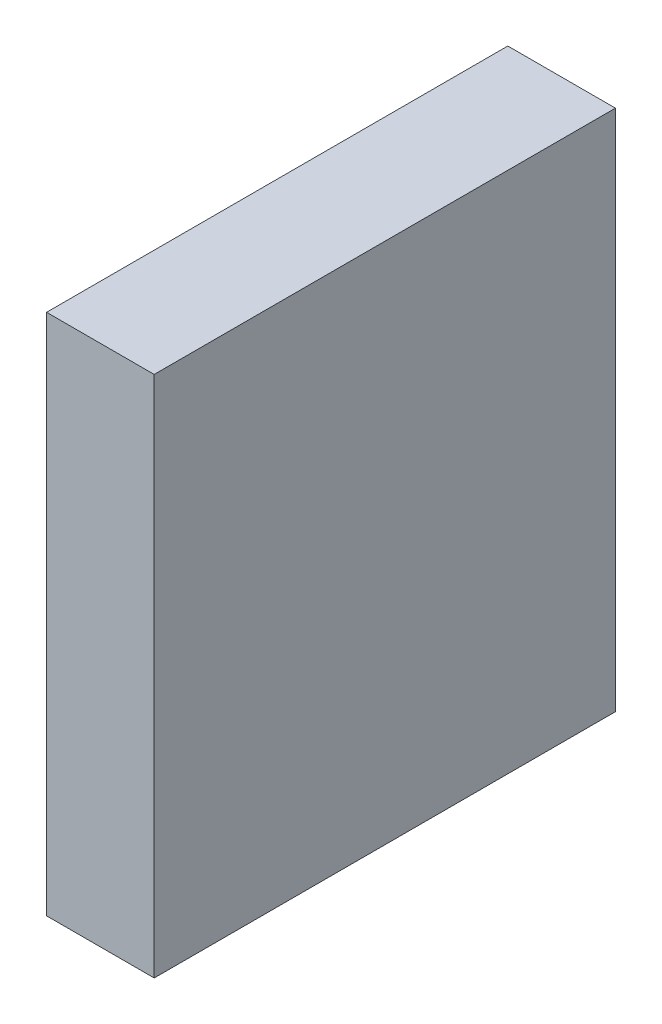
ISO-10303-21;
HEADER;
FILE_DESCRIPTION(('STEP AP214'),'2;1');
FILE_NAME('part.step','',(''),(''),'','','');
FILE_SCHEMA(('AUTOMOTIVE_DESIGN { 1 0 10303 214 1 1 1 1 }'));
ENDSEC;
DATA;
#1=APPLICATION_CONTEXT('core data for automotive mechanical design processes');
#2=APPLICATION_PROTOCOL_DEFINITION('international standard','automotive_design',2000,#1);
#3=PRODUCT_CONTEXT('',#1,'mechanical');
#4=PRODUCT('Part','Part','',(#3));
#5=PRODUCT_RELATED_PRODUCT_CATEGORY('part','',(#4));
#6=PRODUCT_DEFINITION_FORMATION('','',#4);
#7=PRODUCT_DEFINITION_CONTEXT('part definition',#1,'design');
#8=PRODUCT_DEFINITION('design','',#6,#7);
#9=PRODUCT_DEFINITION_SHAPE('','',#8);
#10=(LENGTH_UNIT() NAMED_UNIT(*) SI_UNIT(.MILLI.,.METRE.));
#11=(NAMED_UNIT(*) PLANE_ANGLE_UNIT() SI_UNIT($,.RADIAN.));
#12=(NAMED_UNIT(*) SI_UNIT($,.STERADIAN.) SOLID_ANGLE_UNIT());
#13=UNCERTAINTY_MEASURE_WITH_UNIT(LENGTH_MEASURE(1.E-05),#10,'distance_accuracy_value','');
#14=(GEOMETRIC_REPRESENTATION_CONTEXT(3) GLOBAL_UNCERTAINTY_ASSIGNED_CONTEXT((#13)) GLOBAL_UNIT_ASSIGNED_CONTEXT((#10,
#11,#12)) REPRESENTATION_CONTEXT('',''));
#15=CARTESIAN_POINT('',(0.,0.,0.));
#16=DIRECTION('',(0.,0.,1.));
#17=DIRECTION('',(1.,0.,0.));
#18=AXIS2_PLACEMENT_3D('',#15,#16,#17);
#19=CARTESIAN_POINT('',(0.6,-0.425,0.));
#20=DIRECTION('',(-1.,0.,0.));
#21=DIRECTION('',(0.,0.,1.));
#22=AXIS2_PLACEMENT_3D('',#19,#20,#21);
#23=PLANE('',#22);
#24=DIRECTION('',(0.,0.,1.));
#25=VECTOR('',#24,1.);
#26=CARTESIAN_POINT('',(0.6,0.425,0.));
#27=LINE('',#26,#25);
#28=CARTESIAN_POINT('',(0.6,0.425,0.));
#29=VERTEX_POINT('',#28);
#30=CARTESIAN_POINT('',(0.6,0.425,0.75));
#31=VERTEX_POINT('',#30);
#32=EDGE_CURVE('E20',#29,#31,#27,.T.);
#33=ORIENTED_EDGE('',*,*,#32,.F.);
#34=DIRECTION('',(0.,1.,0.));
#35=VECTOR('',#34,1.);
#36=CARTESIAN_POINT('',(0.6,0.,0.));
#37=LINE('',#36,#35);
#38=CARTESIAN_POINT('',(0.6,-0.425,0.));
#39=VERTEX_POINT('',#38);
#40=EDGE_CURVE('E79',#29,#39,#37,.F.);
#41=ORIENTED_EDGE('',*,*,#40,.T.);
#42=DIRECTION('',(0.,0.,-1.));
#43=VECTOR('',#42,1.);
#44=CARTESIAN_POINT('',(0.6,-0.425,0.));
#45=LINE('',#44,#43);
#46=CARTESIAN_POINT('',(0.6,-0.425,0.75));
#47=VERTEX_POINT('',#46);
#48=EDGE_CURVE('E61',#47,#39,#45,.T.);
#49=ORIENTED_EDGE('',*,*,#48,.F.);
#50=DIRECTION('',(0.,1.,0.));
#51=VECTOR('',#50,1.);
#52=CARTESIAN_POINT('',(0.6,0.,0.75));
#53=LINE('',#52,#51);
#54=EDGE_CURVE('E56',#31,#47,#53,.F.);
#55=ORIENTED_EDGE('',*,*,#54,.F.);
#56=EDGE_LOOP('',(#33,#41,#49,#55));
#57=FACE_BOUND('',#56,.T.);
#58=ADVANCED_FACE('F17',(#57),#23,.T.);
#59=CARTESIAN_POINT('',(0.6,0.425,0.));
#60=DIRECTION('',(0.,1.,0.));
#61=DIRECTION('',(0.,0.,1.));
#62=AXIS2_PLACEMENT_3D('',#59,#60,#61);
#63=PLANE('',#62);
#64=DIRECTION('',(0.,0.,-1.));
#65=VECTOR('',#64,1.);
#66=CARTESIAN_POINT('',(0.775,0.425,0.));
#67=LINE('',#66,#65);
#68=CARTESIAN_POINT('',(0.775,0.425,0.));
#69=VERTEX_POINT('',#68);
#70=CARTESIAN_POINT('',(0.775,0.425,0.75));
#71=VERTEX_POINT('',#70);
#72=EDGE_CURVE('E83',#69,#71,#67,.F.);
#73=ORIENTED_EDGE('',*,*,#72,.F.);
#74=DIRECTION('',(1.,0.,0.));
#75=VECTOR('',#74,1.);
#76=CARTESIAN_POINT('',(0.6875,0.425,0.));
#77=LINE('',#76,#75);
#78=EDGE_CURVE('E68',#69,#29,#77,.F.);
#79=ORIENTED_EDGE('',*,*,#78,.T.);
#80=ORIENTED_EDGE('',*,*,#32,.T.);
#81=DIRECTION('',(1.,0.,0.));
#82=VECTOR('',#81,1.);
#83=CARTESIAN_POINT('',(0.6875,0.425,0.75));
#84=LINE('',#83,#82);
#85=EDGE_CURVE('E63',#71,#31,#84,.F.);
#86=ORIENTED_EDGE('',*,*,#85,.F.);
#87=EDGE_LOOP('',(#73,#79,#80,#86));
#88=FACE_BOUND('',#87,.T.);
#89=ADVANCED_FACE('F65',(#88),#63,.T.);
#90=CARTESIAN_POINT('',(0.6875,0.,0.75));
#91=DIRECTION('',(0.,0.,1.));
#92=DIRECTION('',(1.,0.,0.));
#93=AXIS2_PLACEMENT_3D('',#90,#91,#92);
#94=PLANE('',#93);
#95=DIRECTION('',(0.,1.,0.));
#96=VECTOR('',#95,1.);
#97=CARTESIAN_POINT('',(0.775,0.425,0.75));
#98=LINE('',#97,#96);
#99=CARTESIAN_POINT('',(0.775,-0.425,0.75));
#100=VERTEX_POINT('',#99);
#101=EDGE_CURVE('E72',#71,#100,#98,.F.);
#102=ORIENTED_EDGE('',*,*,#101,.F.);
#103=ORIENTED_EDGE('',*,*,#85,.T.);
#104=ORIENTED_EDGE('',*,*,#54,.T.);
#105=DIRECTION('',(1.,0.,0.));
#106=VECTOR('',#105,1.);
#107=CARTESIAN_POINT('',(0.775,-0.425,0.75));
#108=LINE('',#107,#106);
#109=EDGE_CURVE('E74',#100,#47,#108,.F.);
#110=ORIENTED_EDGE('',*,*,#109,.F.);
#111=EDGE_LOOP('',(#102,#103,#104,#110));
#112=FACE_BOUND('',#111,.T.);
#113=ADVANCED_FACE('F70',(#112),#94,.T.);
#114=CARTESIAN_POINT('',(0.775,-0.425,0.));
#115=DIRECTION('',(0.,-1.,0.));
#116=DIRECTION('',(0.,0.,-1.));
#117=AXIS2_PLACEMENT_3D('',#114,#115,#116);
#118=PLANE('',#117);
#119=ORIENTED_EDGE('',*,*,#48,.T.);
#120=DIRECTION('',(1.,0.,0.));
#121=VECTOR('',#120,1.);
#122=CARTESIAN_POINT('',(0.6875,-0.425,0.));
#123=LINE('',#122,#121);
#124=CARTESIAN_POINT('',(0.775,-0.425,0.));
#125=VERTEX_POINT('',#124);
#126=EDGE_CURVE('E35',#39,#125,#123,.T.);
#127=ORIENTED_EDGE('',*,*,#126,.T.);
#128=DIRECTION('',(0.,0.,-1.));
#129=VECTOR('',#128,1.);
#130=CARTESIAN_POINT('',(0.775,-0.425,0.));
#131=LINE('',#130,#129);
#132=EDGE_CURVE('E26',#100,#125,#131,.T.);
#133=ORIENTED_EDGE('',*,*,#132,.F.);
#134=ORIENTED_EDGE('',*,*,#109,.T.);
#135=EDGE_LOOP('',(#119,#127,#133,#134));
#136=FACE_BOUND('',#135,.T.);
#137=ADVANCED_FACE('F89',(#136),#118,.T.);
#138=CARTESIAN_POINT('',(0.6875,0.,0.));
#139=DIRECTION('',(0.,0.,1.));
#140=DIRECTION('',(1.,0.,0.));
#141=AXIS2_PLACEMENT_3D('',#138,#139,#140);
#142=PLANE('',#141);
#143=DIRECTION('',(0.,1.,0.));
#144=VECTOR('',#143,1.);
#145=CARTESIAN_POINT('',(0.775,0.425,0.));
#146=LINE('',#145,#144);
#147=EDGE_CURVE('E11',#125,#69,#146,.T.);
#148=ORIENTED_EDGE('',*,*,#147,.F.);
#149=ORIENTED_EDGE('',*,*,#126,.F.);
#150=ORIENTED_EDGE('',*,*,#40,.F.);
#151=ORIENTED_EDGE('',*,*,#78,.F.);
#152=EDGE_LOOP('',(#148,#149,#150,#151));
#153=FACE_BOUND('',#152,.T.);
#154=ADVANCED_FACE('F91',(#153),#142,.F.);
#155=CARTESIAN_POINT('',(0.775,0.425,0.));
#156=DIRECTION('',(1.,0.,0.));
#157=DIRECTION('',(0.,0.,-1.));
#158=AXIS2_PLACEMENT_3D('',#155,#156,#157);
#159=PLANE('',#158);
#160=ORIENTED_EDGE('',*,*,#132,.T.);
#161=ORIENTED_EDGE('',*,*,#147,.T.);
#162=ORIENTED_EDGE('',*,*,#72,.T.);
#163=ORIENTED_EDGE('',*,*,#101,.T.);
#164=EDGE_LOOP('',(#160,#161,#162,#163));
#165=FACE_BOUND('',#164,.T.);
#166=ADVANCED_FACE('F88',(#165),#159,.T.);
#167=CLOSED_SHELL('',(#58,#89,#113,#137,#154,#166));
#168=MANIFOLD_SOLID_BREP('B1',#167);
#169=ADVANCED_BREP_SHAPE_REPRESENTATION('',(#18,#168),#14);
#170=SHAPE_DEFINITION_REPRESENTATION(#9,#169);
ENDSEC;
END-ISO-10303-21;
